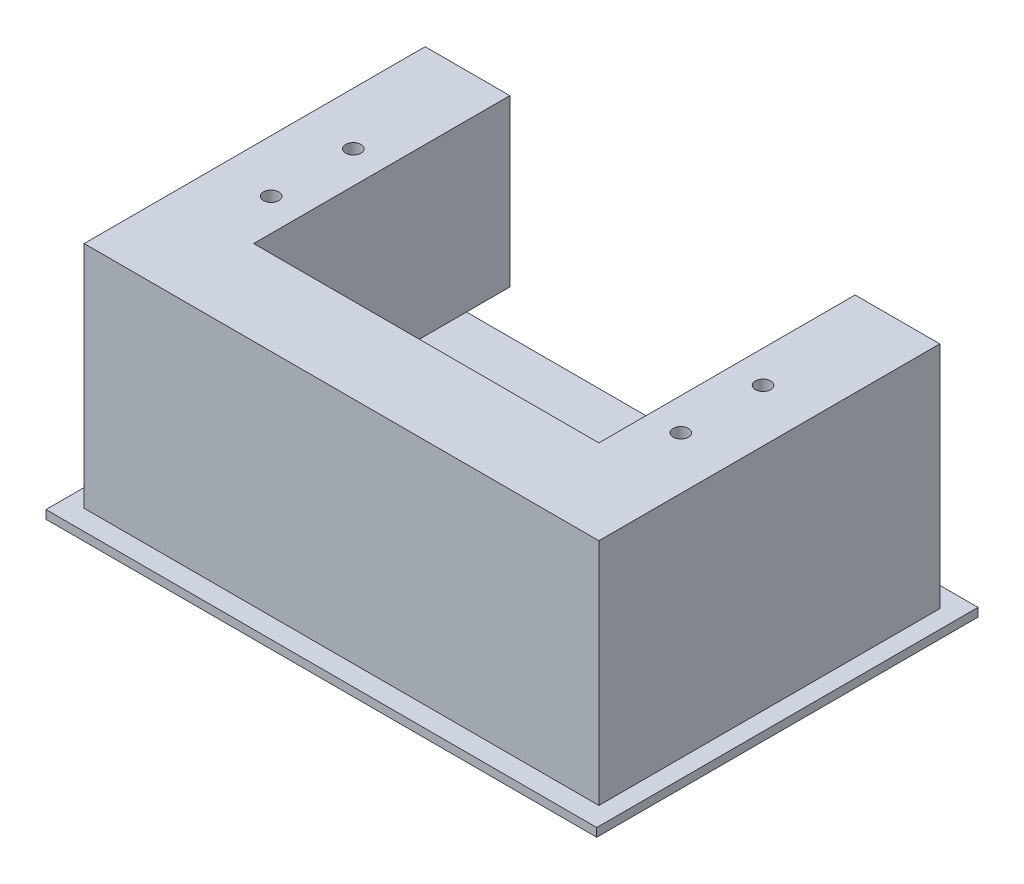
ISO-10303-21;
HEADER;
FILE_DESCRIPTION(('STEP AP214'),'2;1');
FILE_NAME('part.step','',(''),(''),'','','');
FILE_SCHEMA(('AUTOMOTIVE_DESIGN { 1 0 10303 214 1 1 1 1 }'));
ENDSEC;
DATA;
#1=APPLICATION_CONTEXT('core data for automotive mechanical design processes');
#2=APPLICATION_PROTOCOL_DEFINITION('international standard','automotive_design',2000,#1);
#3=PRODUCT_CONTEXT('',#1,'mechanical');
#4=PRODUCT('Part','Part','',(#3));
#5=PRODUCT_RELATED_PRODUCT_CATEGORY('part','',(#4));
#6=PRODUCT_DEFINITION_FORMATION('','',#4);
#7=PRODUCT_DEFINITION_CONTEXT('part definition',#1,'design');
#8=PRODUCT_DEFINITION('design','',#6,#7);
#9=PRODUCT_DEFINITION_SHAPE('','',#8);
#10=(LENGTH_UNIT() NAMED_UNIT(*) SI_UNIT(.MILLI.,.METRE.));
#11=(NAMED_UNIT(*) PLANE_ANGLE_UNIT() SI_UNIT($,.RADIAN.));
#12=(NAMED_UNIT(*) SI_UNIT($,.STERADIAN.) SOLID_ANGLE_UNIT());
#13=UNCERTAINTY_MEASURE_WITH_UNIT(LENGTH_MEASURE(1.E-05),#10,'distance_accuracy_value','');
#14=(GEOMETRIC_REPRESENTATION_CONTEXT(3) GLOBAL_UNCERTAINTY_ASSIGNED_CONTEXT((#13)) GLOBAL_UNIT_ASSIGNED_CONTEXT((#10,
#11,#12)) REPRESENTATION_CONTEXT('',''));
#15=CARTESIAN_POINT('',(0.,0.,0.));
#16=DIRECTION('',(0.,0.,1.));
#17=DIRECTION('',(1.,0.,0.));
#18=AXIS2_PLACEMENT_3D('',#15,#16,#17);
#19=CARTESIAN_POINT('',(20.375,28.06,-20.12));
#20=DIRECTION('',(0.,0.,-1.));
#21=DIRECTION('',(-1.,0.,0.));
#22=AXIS2_PLACEMENT_3D('',#19,#20,#21);
#23=PLANE('',#22);
#24=DIRECTION('',(1.,0.,0.));
#25=VECTOR('',#24,1.);
#26=CARTESIAN_POINT('',(20.375,28.06,-20.12));
#27=LINE('',#26,#25);
#28=CARTESIAN_POINT('',(-30.375,28.06,-20.12));
#29=VERTEX_POINT('',#28);
#30=CARTESIAN_POINT('',(-20.375,28.06,-20.12));
#31=VERTEX_POINT('',#30);
#32=EDGE_CURVE('E153',#29,#31,#27,.T.);
#33=ORIENTED_EDGE('',*,*,#32,.T.);
#34=DIRECTION('',(0.,1.,0.));
#35=VECTOR('',#34,1.);
#36=CARTESIAN_POINT('',(-20.375,-40.9590574250661,-20.12));
#37=LINE('',#36,#35);
#38=CARTESIAN_POINT('',(-20.375,8.49999999999999,-20.12));
#39=VERTEX_POINT('',#38);
#40=EDGE_CURVE('E162',#39,#31,#37,.T.);
#41=ORIENTED_EDGE('',*,*,#40,.F.);
#42=DIRECTION('',(-1.,0.,0.));
#43=VECTOR('',#42,1.);
#44=CARTESIAN_POINT('',(38.1090040599973,8.49999999999999,-20.12));
#45=LINE('',#44,#43);
#46=CARTESIAN_POINT('',(-30.375,8.49999999999999,-20.12));
#47=VERTEX_POINT('',#46);
#48=EDGE_CURVE('E270',#39,#47,#45,.T.);
#49=ORIENTED_EDGE('',*,*,#48,.T.);
#50=DIRECTION('',(0.,-1.,0.));
#51=VECTOR('',#50,1.);
#52=CARTESIAN_POINT('',(-30.375,28.06,-20.12));
#53=LINE('',#52,#51);
#54=EDGE_CURVE('E172',#29,#47,#53,.T.);
#55=ORIENTED_EDGE('',*,*,#54,.F.);
#56=EDGE_LOOP('',(#33,#41,#49,#55));
#57=FACE_BOUND('',#56,.T.);
#58=ADVANCED_FACE('F43',(#57),#23,.T.);
#59=CARTESIAN_POINT('',(32.501,8.5,-4.05));
#60=DIRECTION('',(0.,1.,0.));
#61=DIRECTION('',(0.,0.,1.));
#62=AXIS2_PLACEMENT_3D('',#59,#60,#61);
#63=PLANE('',#62);
#64=ORIENTED_EDGE('',*,*,#48,.F.);
#65=DIRECTION('',(0.,0.,-1.));
#66=VECTOR('',#65,1.);
#67=CARTESIAN_POINT('',(-20.375,8.5,-4.05000000000001));
#68=LINE('',#67,#66);
#69=CARTESIAN_POINT('',(-20.375,8.5,4.05));
#70=VERTEX_POINT('',#69);
#71=EDGE_CURVE('E166',#70,#39,#68,.T.);
#72=ORIENTED_EDGE('',*,*,#71,.F.);
#73=DIRECTION('',(-1.,0.,0.));
#74=VECTOR('',#73,1.);
#75=CARTESIAN_POINT('',(32.501,8.5,4.05));
#76=LINE('',#75,#74);
#77=CARTESIAN_POINT('',(-30.375,8.5,4.05));
#78=VERTEX_POINT('',#77);
#79=EDGE_CURVE('E242',#70,#78,#76,.T.);
#80=ORIENTED_EDGE('',*,*,#79,.T.);
#81=DIRECTION('',(0.,0.,-1.));
#82=VECTOR('',#81,1.);
#83=CARTESIAN_POINT('',(-30.375,8.5,-4.05));
#84=LINE('',#83,#82);
#85=EDGE_CURVE('E286',#78,#47,#84,.T.);
#86=ORIENTED_EDGE('',*,*,#85,.T.);
#87=EDGE_LOOP('',(#64,#72,#80,#86));
#88=FACE_BOUND('',#87,.T.);
#89=ADVANCED_FACE('F321',(#88),#63,.F.);
#90=CARTESIAN_POINT('',(0.,1.,0.));
#91=DIRECTION('',(0.,-1.,0.));
#92=DIRECTION('',(0.,0.,-1.));
#93=AXIS2_PLACEMENT_3D('',#90,#91,#92);
#94=PLANE('',#93);
#95=DIRECTION('',(0.,0.,1.));
#96=VECTOR('',#95,1.);
#97=CARTESIAN_POINT('',(20.375,1.,-20.12));
#98=LINE('',#97,#96);
#99=CARTESIAN_POINT('',(20.375,1.,-20.12));
#100=VERTEX_POINT('',#99);
#101=CARTESIAN_POINT('',(20.375,1.,10.12));
#102=VERTEX_POINT('',#101);
#103=EDGE_CURVE('E60',#100,#102,#98,.T.);
#104=ORIENTED_EDGE('',*,*,#103,.F.);
#105=DIRECTION('',(1.,0.,0.));
#106=VECTOR('',#105,1.);
#107=CARTESIAN_POINT('',(20.375,1.,-20.12));
#108=LINE('',#107,#106);
#109=CARTESIAN_POINT('',(30.375,1.,-20.12));
#110=VERTEX_POINT('',#109);
#111=EDGE_CURVE('E189',#100,#110,#108,.T.);
#112=ORIENTED_EDGE('',*,*,#111,.T.);
#113=DIRECTION('',(0.,0.,1.));
#114=VECTOR('',#113,1.);
#115=CARTESIAN_POINT('',(30.375,1.,-20.12));
#116=LINE('',#115,#114);
#117=CARTESIAN_POINT('',(30.375,1.,20.12));
#118=VERTEX_POINT('',#117);
#119=EDGE_CURVE('E186',#110,#118,#116,.T.);
#120=ORIENTED_EDGE('',*,*,#119,.T.);
#121=DIRECTION('',(1.,0.,0.));
#122=VECTOR('',#121,1.);
#123=CARTESIAN_POINT('',(20.375,1.,20.12));
#124=LINE('',#123,#122);
#125=CARTESIAN_POINT('',(-30.375,1.,20.12));
#126=VERTEX_POINT('',#125);
#127=EDGE_CURVE('E183',#126,#118,#124,.T.);
#128=ORIENTED_EDGE('',*,*,#127,.F.);
#129=DIRECTION('',(0.,0.,1.));
#130=VECTOR('',#129,1.);
#131=CARTESIAN_POINT('',(-30.375,1.,-20.12));
#132=LINE('',#131,#130);
#133=CARTESIAN_POINT('',(-30.375,1.,4.05));
#134=VERTEX_POINT('',#133);
#135=EDGE_CURVE('E159',#134,#126,#132,.T.);
#136=ORIENTED_EDGE('',*,*,#135,.F.);
#137=DIRECTION('',(-1.,0.,0.));
#138=VECTOR('',#137,1.);
#139=CARTESIAN_POINT('',(32.501,1.,4.05));
#140=LINE('',#139,#138);
#141=CARTESIAN_POINT('',(-20.375,1.,4.05));
#142=VERTEX_POINT('',#141);
#143=EDGE_CURVE('E285',#142,#134,#140,.T.);
#144=ORIENTED_EDGE('',*,*,#143,.F.);
#145=DIRECTION('',(0.,0.,1.));
#146=VECTOR('',#145,1.);
#147=CARTESIAN_POINT('',(-20.375,1.,-20.12));
#148=LINE('',#147,#146);
#149=CARTESIAN_POINT('',(-20.375,1.,10.12));
#150=VERTEX_POINT('',#149);
#151=EDGE_CURVE('E235',#142,#150,#148,.T.);
#152=ORIENTED_EDGE('',*,*,#151,.T.);
#153=DIRECTION('',(1.,0.,0.));
#154=VECTOR('',#153,1.);
#155=CARTESIAN_POINT('',(-20.375,1.,10.12));
#156=LINE('',#155,#154);
#157=EDGE_CURVE('E280',#150,#102,#156,.T.);
#158=ORIENTED_EDGE('',*,*,#157,.T.);
#159=EDGE_LOOP('',(#104,#112,#120,#128,#136,#144,#152,#158));
#160=FACE_BOUND('',#159,.T.);
#161=DIRECTION('',(0.,0.,-1.));
#162=VECTOR('',#161,1.);
#163=CARTESIAN_POINT('',(32.5,1.,22.5));
#164=LINE('',#163,#162);
#165=CARTESIAN_POINT('',(32.5,1.,22.5));
#166=VERTEX_POINT('',#165);
#167=CARTESIAN_POINT('',(32.5,1.,-22.5));
#168=VERTEX_POINT('',#167);
#169=EDGE_CURVE('E199',#166,#168,#164,.T.);
#170=ORIENTED_EDGE('',*,*,#169,.T.);
#171=DIRECTION('',(-1.,0.,0.));
#172=VECTOR('',#171,1.);
#173=CARTESIAN_POINT('',(-32.5,1.,-22.5));
#174=LINE('',#173,#172);
#175=CARTESIAN_POINT('',(-32.5,1.,-22.5));
#176=VERTEX_POINT('',#175);
#177=EDGE_CURVE('E202',#168,#176,#174,.T.);
#178=ORIENTED_EDGE('',*,*,#177,.T.);
#179=DIRECTION('',(0.,0.,1.));
#180=VECTOR('',#179,1.);
#181=CARTESIAN_POINT('',(-32.5,1.,22.5));
#182=LINE('',#181,#180);
#183=CARTESIAN_POINT('',(-32.5,1.,22.5));
#184=VERTEX_POINT('',#183);
#185=EDGE_CURVE('E205',#176,#184,#182,.T.);
#186=ORIENTED_EDGE('',*,*,#185,.T.);
#187=DIRECTION('',(1.,0.,0.));
#188=VECTOR('',#187,1.);
#189=CARTESIAN_POINT('',(-32.5,1.,22.5));
#190=LINE('',#189,#188);
#191=EDGE_CURVE('E207',#184,#166,#190,.T.);
#192=ORIENTED_EDGE('',*,*,#191,.T.);
#193=EDGE_LOOP('',(#170,#178,#186,#192));
#194=FACE_BOUND('',#193,.T.);
#195=ADVANCED_FACE('F302',(#160,#194),#94,.F.);
#196=CARTESIAN_POINT('',(20.375,28.06,-20.12));
#197=DIRECTION('',(1.,0.,0.));
#198=DIRECTION('',(0.,0.,-1.));
#199=AXIS2_PLACEMENT_3D('',#196,#197,#198);
#200=PLANE('',#199);
#201=ORIENTED_EDGE('',*,*,#103,.T.);
#202=DIRECTION('',(0.,-1.,0.));
#203=VECTOR('',#202,1.);
#204=CARTESIAN_POINT('',(20.375,70.0190574250662,10.12));
#205=LINE('',#204,#203);
#206=CARTESIAN_POINT('',(20.375,28.06,10.12));
#207=VERTEX_POINT('',#206);
#208=EDGE_CURVE('E274',#207,#102,#205,.T.);
#209=ORIENTED_EDGE('',*,*,#208,.F.);
#210=DIRECTION('',(0.,0.,1.));
#211=VECTOR('',#210,1.);
#212=CARTESIAN_POINT('',(20.375,28.06,-20.12));
#213=LINE('',#212,#211);
#214=CARTESIAN_POINT('',(20.375,28.06,-20.12));
#215=VERTEX_POINT('',#214);
#216=EDGE_CURVE('E174',#215,#207,#213,.T.);
#217=ORIENTED_EDGE('',*,*,#216,.F.);
#218=DIRECTION('',(0.,-1.,0.));
#219=VECTOR('',#218,1.);
#220=CARTESIAN_POINT('',(20.375,8.49999999999999,-20.12));
#221=LINE('',#220,#219);
#222=EDGE_CURVE('E169',#215,#100,#221,.T.);
#223=ORIENTED_EDGE('',*,*,#222,.T.);
#224=EDGE_LOOP('',(#201,#209,#217,#223));
#225=FACE_BOUND('',#224,.T.);
#226=ADVANCED_FACE('F272',(#225),#200,.F.);
#227=CARTESIAN_POINT('',(-20.375,28.06,-20.12));
#228=DIRECTION('',(1.,0.,0.));
#229=DIRECTION('',(0.,0.,-1.));
#230=AXIS2_PLACEMENT_3D('',#227,#228,#229);
#231=PLANE('',#230);
#232=ORIENTED_EDGE('',*,*,#71,.T.);
#233=ORIENTED_EDGE('',*,*,#40,.T.);
#234=DIRECTION('',(0.,0.,1.));
#235=VECTOR('',#234,1.);
#236=CARTESIAN_POINT('',(-20.375,28.06,-20.12));
#237=LINE('',#236,#235);
#238=CARTESIAN_POINT('',(-20.375,28.06,10.12));
#239=VERTEX_POINT('',#238);
#240=EDGE_CURVE('E146',#31,#239,#237,.T.);
#241=ORIENTED_EDGE('',*,*,#240,.T.);
#242=DIRECTION('',(0.,-1.,0.));
#243=VECTOR('',#242,1.);
#244=CARTESIAN_POINT('',(-20.375,70.0190574250662,10.12));
#245=LINE('',#244,#243);
#246=EDGE_CURVE('E68',#239,#150,#245,.T.);
#247=ORIENTED_EDGE('',*,*,#246,.T.);
#248=ORIENTED_EDGE('',*,*,#151,.F.);
#249=DIRECTION('',(0.,1.,0.));
#250=VECTOR('',#249,1.);
#251=CARTESIAN_POINT('',(-20.375,8.5,4.05));
#252=LINE('',#251,#250);
#253=EDGE_CURVE('E291',#142,#70,#252,.T.);
#254=ORIENTED_EDGE('',*,*,#253,.T.);
#255=EDGE_LOOP('',(#232,#233,#241,#247,#248,#254));
#256=FACE_BOUND('',#255,.T.);
#257=ADVANCED_FACE('F163',(#256),#231,.T.);
#258=CARTESIAN_POINT('',(32.5,1.,22.5));
#259=DIRECTION('',(-1.,0.,0.));
#260=DIRECTION('',(0.,0.,1.));
#261=AXIS2_PLACEMENT_3D('',#258,#259,#260);
#262=PLANE('',#261);
#263=DIRECTION('',(0.,0.,-1.));
#264=VECTOR('',#263,1.);
#265=CARTESIAN_POINT('',(32.5,0.,22.5));
#266=LINE('',#265,#264);
#267=CARTESIAN_POINT('',(32.5,0.,22.5));
#268=VERTEX_POINT('',#267);
#269=CARTESIAN_POINT('',(32.5,0.,-22.5));
#270=VERTEX_POINT('',#269);
#271=EDGE_CURVE('E198',#268,#270,#266,.T.);
#272=ORIENTED_EDGE('',*,*,#271,.T.);
#273=DIRECTION('',(0.,-1.,0.));
#274=VECTOR('',#273,1.);
#275=CARTESIAN_POINT('',(32.5,1.,-22.5));
#276=LINE('',#275,#274);
#277=EDGE_CURVE('E11',#168,#270,#276,.T.);
#278=ORIENTED_EDGE('',*,*,#277,.F.);
#279=ORIENTED_EDGE('',*,*,#169,.F.);
#280=DIRECTION('',(0.,-1.,0.));
#281=VECTOR('',#280,1.);
#282=CARTESIAN_POINT('',(32.5,1.,22.5));
#283=LINE('',#282,#281);
#284=EDGE_CURVE('E209',#166,#268,#283,.T.);
#285=ORIENTED_EDGE('',*,*,#284,.T.);
#286=EDGE_LOOP('',(#272,#278,#279,#285));
#287=FACE_BOUND('',#286,.T.);
#288=ADVANCED_FACE('F45',(#287),#262,.F.);
#289=CARTESIAN_POINT('',(-32.5,1.,-22.5));
#290=DIRECTION('',(0.,0.,1.));
#291=DIRECTION('',(1.,0.,0.));
#292=AXIS2_PLACEMENT_3D('',#289,#290,#291);
#293=PLANE('',#292);
#294=DIRECTION('',(-1.,0.,0.));
#295=VECTOR('',#294,1.);
#296=CARTESIAN_POINT('',(-32.5,0.,-22.5));
#297=LINE('',#296,#295);
#298=CARTESIAN_POINT('',(-32.5,0.,-22.5));
#299=VERTEX_POINT('',#298);
#300=EDGE_CURVE('E212',#270,#299,#297,.T.);
#301=ORIENTED_EDGE('',*,*,#300,.T.);
#302=DIRECTION('',(0.,-1.,0.));
#303=VECTOR('',#302,1.);
#304=CARTESIAN_POINT('',(-32.5,1.,-22.5));
#305=LINE('',#304,#303);
#306=EDGE_CURVE('E52',#176,#299,#305,.T.);
#307=ORIENTED_EDGE('',*,*,#306,.F.);
#308=ORIENTED_EDGE('',*,*,#177,.F.);
#309=ORIENTED_EDGE('',*,*,#277,.T.);
#310=EDGE_LOOP('',(#301,#307,#308,#309));
#311=FACE_BOUND('',#310,.T.);
#312=ADVANCED_FACE('F357',(#311),#293,.F.);
#313=CARTESIAN_POINT('',(-32.5,1.,22.5));
#314=DIRECTION('',(1.,0.,0.));
#315=DIRECTION('',(0.,0.,-1.));
#316=AXIS2_PLACEMENT_3D('',#313,#314,#315);
#317=PLANE('',#316);
#318=DIRECTION('',(0.,0.,1.));
#319=VECTOR('',#318,1.);
#320=CARTESIAN_POINT('',(-32.5,0.,22.5));
#321=LINE('',#320,#319);
#322=CARTESIAN_POINT('',(-32.5,0.,22.5));
#323=VERTEX_POINT('',#322);
#324=EDGE_CURVE('E214',#299,#323,#321,.T.);
#325=ORIENTED_EDGE('',*,*,#324,.T.);
#326=DIRECTION('',(0.,-1.,0.));
#327=VECTOR('',#326,1.);
#328=CARTESIAN_POINT('',(-32.5,1.,22.5));
#329=LINE('',#328,#327);
#330=EDGE_CURVE('E219',#184,#323,#329,.T.);
#331=ORIENTED_EDGE('',*,*,#330,.F.);
#332=ORIENTED_EDGE('',*,*,#185,.F.);
#333=ORIENTED_EDGE('',*,*,#306,.T.);
#334=EDGE_LOOP('',(#325,#331,#332,#333));
#335=FACE_BOUND('',#334,.T.);
#336=ADVANCED_FACE('F354',(#335),#317,.F.);
#337=CARTESIAN_POINT('',(-32.5,1.,22.5));
#338=DIRECTION('',(0.,0.,-1.));
#339=DIRECTION('',(-1.,0.,0.));
#340=AXIS2_PLACEMENT_3D('',#337,#338,#339);
#341=PLANE('',#340);
#342=DIRECTION('',(1.,0.,0.));
#343=VECTOR('',#342,1.);
#344=CARTESIAN_POINT('',(-32.5,0.,22.5));
#345=LINE('',#344,#343);
#346=EDGE_CURVE('E203',#323,#268,#345,.T.);
#347=ORIENTED_EDGE('',*,*,#346,.T.);
#348=ORIENTED_EDGE('',*,*,#284,.F.);
#349=ORIENTED_EDGE('',*,*,#191,.F.);
#350=ORIENTED_EDGE('',*,*,#330,.T.);
#351=EDGE_LOOP('',(#347,#348,#349,#350));
#352=FACE_BOUND('',#351,.T.);
#353=ADVANCED_FACE('F316',(#352),#341,.F.);
#354=CARTESIAN_POINT('',(0.,0.,0.));
#355=DIRECTION('',(0.,-1.,0.));
#356=DIRECTION('',(0.,0.,-1.));
#357=AXIS2_PLACEMENT_3D('',#354,#355,#356);
#358=PLANE('',#357);
#359=ORIENTED_EDGE('',*,*,#271,.F.);
#360=ORIENTED_EDGE('',*,*,#346,.F.);
#361=ORIENTED_EDGE('',*,*,#324,.F.);
#362=ORIENTED_EDGE('',*,*,#300,.F.);
#363=EDGE_LOOP('',(#359,#360,#361,#362));
#364=FACE_BOUND('',#363,.T.);
#365=ADVANCED_FACE('F307',(#364),#358,.T.);
#366=CARTESIAN_POINT('',(20.375,28.06,20.12));
#367=DIRECTION('',(0.,0.,-1.));
#368=DIRECTION('',(-1.,0.,0.));
#369=AXIS2_PLACEMENT_3D('',#366,#367,#368);
#370=PLANE('',#369);
#371=ORIENTED_EDGE('',*,*,#127,.T.);
#372=DIRECTION('',(0.,-1.,0.));
#373=VECTOR('',#372,1.);
#374=CARTESIAN_POINT('',(30.375,28.06,20.12));
#375=LINE('',#374,#373);
#376=CARTESIAN_POINT('',(30.375,28.06,20.12));
#377=VERTEX_POINT('',#376);
#378=EDGE_CURVE('E195',#377,#118,#375,.T.);
#379=ORIENTED_EDGE('',*,*,#378,.F.);
#380=DIRECTION('',(1.,0.,0.));
#381=VECTOR('',#380,1.);
#382=CARTESIAN_POINT('',(20.375,28.06,20.12));
#383=LINE('',#382,#381);
#384=CARTESIAN_POINT('',(-30.375,28.06,20.12));
#385=VERTEX_POINT('',#384);
#386=EDGE_CURVE('E192',#385,#377,#383,.T.);
#387=ORIENTED_EDGE('',*,*,#386,.F.);
#388=DIRECTION('',(0.,-1.,0.));
#389=VECTOR('',#388,1.);
#390=CARTESIAN_POINT('',(-30.375,28.06,20.12));
#391=LINE('',#390,#389);
#392=EDGE_CURVE('E248',#385,#126,#391,.T.);
#393=ORIENTED_EDGE('',*,*,#392,.T.);
#394=EDGE_LOOP('',(#371,#379,#387,#393));
#395=FACE_BOUND('',#394,.T.);
#396=ADVANCED_FACE('F305',(#395),#370,.F.);
#397=CARTESIAN_POINT('',(30.375,28.06,-20.12));
#398=DIRECTION('',(1.,0.,0.));
#399=DIRECTION('',(0.,0.,-1.));
#400=AXIS2_PLACEMENT_3D('',#397,#398,#399);
#401=PLANE('',#400);
#402=ORIENTED_EDGE('',*,*,#119,.F.);
#403=DIRECTION('',(0.,-1.,0.));
#404=VECTOR('',#403,1.);
#405=CARTESIAN_POINT('',(30.375,28.06,-20.12));
#406=LINE('',#405,#404);
#407=CARTESIAN_POINT('',(30.375,28.06,-20.12));
#408=VERTEX_POINT('',#407);
#409=EDGE_CURVE('E177',#408,#110,#406,.T.);
#410=ORIENTED_EDGE('',*,*,#409,.F.);
#411=DIRECTION('',(0.,0.,1.));
#412=VECTOR('',#411,1.);
#413=CARTESIAN_POINT('',(30.375,28.06,-20.12));
#414=LINE('',#413,#412);
#415=EDGE_CURVE('E179',#408,#377,#414,.T.);
#416=ORIENTED_EDGE('',*,*,#415,.T.);
#417=ORIENTED_EDGE('',*,*,#378,.T.);
#418=EDGE_LOOP('',(#402,#410,#416,#417));
#419=FACE_BOUND('',#418,.T.);
#420=ADVANCED_FACE('F265',(#419),#401,.T.);
#421=ORIENTED_EDGE('',*,*,#222,.F.);
#422=EDGE_CURVE('E175',#215,#408,#27,.T.);
#423=ORIENTED_EDGE('',*,*,#422,.T.);
#424=ORIENTED_EDGE('',*,*,#409,.T.);
#425=ORIENTED_EDGE('',*,*,#111,.F.);
#426=EDGE_LOOP('',(#421,#423,#424,#425));
#427=FACE_BOUND('',#426,.T.);
#428=ADVANCED_FACE('F268',(#427),#23,.T.);
#429=CARTESIAN_POINT('',(0.,28.06,0.));
#430=DIRECTION('',(0.,-1.,0.));
#431=DIRECTION('',(0.,0.,-1.));
#432=AXIS2_PLACEMENT_3D('',#429,#430,#431);
#433=PLANE('',#432);
#434=ORIENTED_EDGE('',*,*,#422,.F.);
#435=ORIENTED_EDGE('',*,*,#216,.T.);
#436=DIRECTION('',(-1.,0.,0.));
#437=VECTOR('',#436,1.);
#438=CARTESIAN_POINT('',(-20.375,28.06,10.12));
#439=LINE('',#438,#437);
#440=EDGE_CURVE('E157',#207,#239,#439,.T.);
#441=ORIENTED_EDGE('',*,*,#440,.T.);
#442=ORIENTED_EDGE('',*,*,#240,.F.);
#443=ORIENTED_EDGE('',*,*,#32,.F.);
#444=DIRECTION('',(0.,0.,1.));
#445=VECTOR('',#444,1.);
#446=CARTESIAN_POINT('',(-30.375,28.06,-20.12));
#447=LINE('',#446,#445);
#448=EDGE_CURVE('E158',#29,#385,#447,.T.);
#449=ORIENTED_EDGE('',*,*,#448,.T.);
#450=ORIENTED_EDGE('',*,*,#386,.T.);
#451=ORIENTED_EDGE('',*,*,#415,.F.);
#452=EDGE_LOOP('',(#434,#435,#441,#442,#443,#449,#450,#451));
#453=FACE_BOUND('',#452,.T.);
#454=CARTESIAN_POINT('',(24.175,28.06,-5.45));
#455=DIRECTION('',(0.,-1.,0.));
#456=DIRECTION('',(0.,0.,-1.));
#457=AXIS2_PLACEMENT_3D('',#454,#455,#456);
#458=CIRCLE('',#457,0.9);
#459=CARTESIAN_POINT('',(24.175,28.06,-6.35));
#460=VERTEX_POINT('',#459);
#461=EDGE_CURVE('E187',#460,#460,#458,.F.);
#462=ORIENTED_EDGE('',*,*,#461,.F.);
#463=EDGE_LOOP('',(#462));
#464=FACE_BOUND('',#463,.T.);
#465=CARTESIAN_POINT('',(24.175,28.06,4.25));
#466=DIRECTION('',(0.,-1.,0.));
#467=DIRECTION('',(0.,0.,-1.));
#468=AXIS2_PLACEMENT_3D('',#465,#466,#467);
#469=CIRCLE('',#468,0.9);
#470=CARTESIAN_POINT('',(24.175,28.06,3.35));
#471=VERTEX_POINT('',#470);
#472=EDGE_CURVE('E224',#471,#471,#469,.F.);
#473=ORIENTED_EDGE('',*,*,#472,.F.);
#474=EDGE_LOOP('',(#473));
#475=FACE_BOUND('',#474,.T.);
#476=CARTESIAN_POINT('',(-24.175,28.06,-5.45));
#477=DIRECTION('',(0.,-1.,0.));
#478=DIRECTION('',(0.,0.,-1.));
#479=AXIS2_PLACEMENT_3D('',#476,#477,#478);
#480=CIRCLE('',#479,0.9);
#481=CARTESIAN_POINT('',(-24.175,28.06,-6.35));
#482=VERTEX_POINT('',#481);
#483=EDGE_CURVE('E47',#482,#482,#480,.T.);
#484=ORIENTED_EDGE('',*,*,#483,.T.);
#485=EDGE_LOOP('',(#484));
#486=FACE_BOUND('',#485,.T.);
#487=CARTESIAN_POINT('',(-24.175,28.06,4.25));
#488=DIRECTION('',(0.,-1.,0.));
#489=DIRECTION('',(0.,0.,-1.));
#490=AXIS2_PLACEMENT_3D('',#487,#488,#489);
#491=CIRCLE('',#490,0.9);
#492=CARTESIAN_POINT('',(-24.175,28.06,3.35));
#493=VERTEX_POINT('',#492);
#494=EDGE_CURVE('E229',#493,#493,#491,.T.);
#495=ORIENTED_EDGE('',*,*,#494,.T.);
#496=EDGE_LOOP('',(#495));
#497=FACE_BOUND('',#496,.T.);
#498=ADVANCED_FACE('F149',(#453,#464,#475,#486,#497),#433,.F.);
#499=CARTESIAN_POINT('',(24.175,28.060012,4.25));
#500=DIRECTION('',(0.,-1.,0.));
#501=DIRECTION('',(0.,0.,-1.));
#502=AXIS2_PLACEMENT_3D('',#499,#500,#501);
#503=CYLINDRICAL_SURFACE('',#502,0.9);
#504=CARTESIAN_POINT('',(24.175,18.06,4.25));
#505=DIRECTION('',(0.,1.,0.));
#506=DIRECTION('',(0.,0.,-1.));
#507=AXIS2_PLACEMENT_3D('',#504,#505,#506);
#508=CIRCLE('',#507,0.9);
#509=CARTESIAN_POINT('',(24.175,18.06,3.35));
#510=VERTEX_POINT('',#509);
#511=EDGE_CURVE('E255',#510,#510,#508,.T.);
#512=CARTESIAN_POINT('',(24.175,18.06,3.35));
#513=CARTESIAN_POINT('',(24.175,18.1641666666667,3.35));
#514=CARTESIAN_POINT('',(24.175,18.2683333333333,3.35));
#515=CARTESIAN_POINT('',(24.175,18.4766666666667,3.35));
#516=CARTESIAN_POINT('',(24.175,18.5808333333333,3.35));
#517=CARTESIAN_POINT('',(24.175,18.7891666666667,3.35));
#518=CARTESIAN_POINT('',(24.175,18.8933333333333,3.35));
#519=CARTESIAN_POINT('',(24.175,19.1016666666667,3.35));
#520=CARTESIAN_POINT('',(24.175,19.2058333333333,3.35));
#521=CARTESIAN_POINT('',(24.175,19.4141666666667,3.35));
#522=CARTESIAN_POINT('',(24.175,19.5183333333333,3.35));
#523=CARTESIAN_POINT('',(24.175,19.7266666666667,3.35));
#524=CARTESIAN_POINT('',(24.175,19.8308333333333,3.35));
#525=CARTESIAN_POINT('',(24.175,20.0391666666667,3.35));
#526=CARTESIAN_POINT('',(24.175,20.1433333333333,3.35));
#527=CARTESIAN_POINT('',(24.175,20.3516666666667,3.35));
#528=CARTESIAN_POINT('',(24.175,20.4558333333333,3.35));
#529=CARTESIAN_POINT('',(24.175,20.6641666666667,3.35));
#530=CARTESIAN_POINT('',(24.175,20.7683333333333,3.35));
#531=CARTESIAN_POINT('',(24.175,20.9766666666667,3.35));
#532=CARTESIAN_POINT('',(24.175,21.0808333333333,3.35));
#533=CARTESIAN_POINT('',(24.175,21.2891666666667,3.35));
#534=CARTESIAN_POINT('',(24.175,21.3933333333333,3.35));
#535=CARTESIAN_POINT('',(24.175,21.6016666666667,3.35));
#536=CARTESIAN_POINT('',(24.175,21.7058333333333,3.35));
#537=CARTESIAN_POINT('',(24.175,21.9141666666667,3.35));
#538=CARTESIAN_POINT('',(24.175,22.0183333333333,3.35));
#539=CARTESIAN_POINT('',(24.175,22.2266666666667,3.35));
#540=CARTESIAN_POINT('',(24.175,22.3308333333333,3.35));
#541=CARTESIAN_POINT('',(24.175,22.5391666666667,3.35));
#542=CARTESIAN_POINT('',(24.175,22.6433333333333,3.35));
#543=CARTESIAN_POINT('',(24.175,22.8516666666667,3.35));
#544=CARTESIAN_POINT('',(24.175,22.9558333333333,3.35));
#545=CARTESIAN_POINT('',(24.175,23.1641666666667,3.35));
#546=CARTESIAN_POINT('',(24.175,23.2683333333333,3.35));
#547=CARTESIAN_POINT('',(24.175,23.4766666666667,3.35));
#548=CARTESIAN_POINT('',(24.175,23.5808333333333,3.35));
#549=CARTESIAN_POINT('',(24.175,23.7891666666667,3.35));
#550=CARTESIAN_POINT('',(24.175,23.8933333333333,3.35));
#551=CARTESIAN_POINT('',(24.175,24.1016666666667,3.35));
#552=CARTESIAN_POINT('',(24.175,24.2058333333333,3.35));
#553=CARTESIAN_POINT('',(24.175,24.4141666666667,3.35));
#554=CARTESIAN_POINT('',(24.175,24.5183333333333,3.35));
#555=CARTESIAN_POINT('',(24.175,24.7266666666667,3.35));
#556=CARTESIAN_POINT('',(24.175,24.8308333333333,3.35));
#557=CARTESIAN_POINT('',(24.175,25.0391666666667,3.35));
#558=CARTESIAN_POINT('',(24.175,25.1433333333333,3.35));
#559=CARTESIAN_POINT('',(24.175,25.3516666666667,3.35));
#560=CARTESIAN_POINT('',(24.175,25.4558333333333,3.35));
#561=CARTESIAN_POINT('',(24.175,25.6641666666667,3.35));
#562=CARTESIAN_POINT('',(24.175,25.7683333333333,3.35));
#563=CARTESIAN_POINT('',(24.175,25.9766666666667,3.35));
#564=CARTESIAN_POINT('',(24.175,26.0808333333333,3.35));
#565=CARTESIAN_POINT('',(24.175,26.2891666666667,3.35));
#566=CARTESIAN_POINT('',(24.175,26.3933333333333,3.35));
#567=CARTESIAN_POINT('',(24.175,26.6016666666667,3.35));
#568=CARTESIAN_POINT('',(24.175,26.7058333333333,3.35));
#569=CARTESIAN_POINT('',(24.175,26.9141666666667,3.35));
#570=CARTESIAN_POINT('',(24.175,27.0183333333333,3.35));
#571=CARTESIAN_POINT('',(24.175,27.2266666666667,3.35));
#572=CARTESIAN_POINT('',(24.175,27.3308333333333,3.35));
#573=CARTESIAN_POINT('',(24.175,27.5391666666667,3.35));
#574=CARTESIAN_POINT('',(24.175,27.6433333333333,3.35));
#575=CARTESIAN_POINT('',(24.175,27.8516666666667,3.35));
#576=CARTESIAN_POINT('',(24.175,27.9558333333333,3.35));
#577=CARTESIAN_POINT('',(24.175,28.06,3.35));
#578=B_SPLINE_CURVE_WITH_KNOTS('',3,(#512,#513,#514,#515,#516,#517,#518,#519,#520,#521,#522,
#523,#524,#525,#526,#527,#528,#529,#530,#531,#532,#533,#534,#535,#536,#537,#538,#539,#540,#541,
#542,#543,#544,#545,#546,#547,#548,#549,#550,#551,#552,#553,#554,#555,#556,#557,#558,#559,#560,
#561,#562,#563,#564,#565,#566,#567,#568,#569,#570,#571,#572,#573,#574,#575,#576,#577),
.UNSPECIFIED.,.F.,.F.,(4,2,2,2,2,2,2,2,2,2,2,2,2,2,2,2,2,2,2,2,2,2,2,2,2,2,2,2,2,2,2,2,4),(0.,
0.3125,0.625000000000001,0.937500000000001,1.25,1.5625,1.875,2.1875,2.5,2.8125,3.125,3.4375,
3.75,4.0625,4.375,4.6875,5.,5.3125,5.625,5.9375,6.25,6.5625,6.875,7.1875,7.5,7.8125,8.125,
8.4375,8.75,9.0625,9.375,9.6875,10.),.UNSPECIFIED.);
#579=EDGE_CURVE('BSEAM335',#510,#471,#578,.T.);
#580=ORIENTED_EDGE('',*,*,#511,.F.);
#581=ORIENTED_EDGE('',*,*,#472,.T.);
#582=ORIENTED_EDGE('',*,*,#579,.T.);
#583=ORIENTED_EDGE('',*,*,#579,.F.);
#584=EDGE_LOOP('',(#580,#582,#581,#583));
#585=FACE_BOUND('',#584,.T.);
#586=ADVANCED_FACE('F335',(#585),#503,.F.);
#587=CARTESIAN_POINT('',(24.175,18.06,4.25));
#588=DIRECTION('',(0.,-1.,0.));
#589=DIRECTION('',(0.,0.,-1.));
#590=AXIS2_PLACEMENT_3D('',#587,#588,#589);
#591=PLANE('',#590);
#592=ORIENTED_EDGE('',*,*,#511,.T.);
#593=EDGE_LOOP('',(#592));
#594=FACE_BOUND('',#593,.T.);
#595=ADVANCED_FACE('F340',(#594),#591,.F.);
#596=CARTESIAN_POINT('',(24.175,28.060012,-5.45));
#597=DIRECTION('',(0.,-1.,0.));
#598=DIRECTION('',(0.,0.,-1.));
#599=AXIS2_PLACEMENT_3D('',#596,#597,#598);
#600=CYLINDRICAL_SURFACE('',#599,0.9);
#601=CARTESIAN_POINT('',(24.175,18.06,-5.45));
#602=DIRECTION('',(0.,1.,0.));
#603=DIRECTION('',(0.,0.,1.));
#604=AXIS2_PLACEMENT_3D('',#601,#602,#603);
#605=CIRCLE('',#604,0.9);
#606=CARTESIAN_POINT('',(24.175,18.06,-6.35));
#607=VERTEX_POINT('',#606);
#608=EDGE_CURVE('E227',#607,#607,#605,.T.);
#609=CARTESIAN_POINT('',(24.175,18.06,-6.35));
#610=CARTESIAN_POINT('',(24.175,18.1641666666667,-6.35));
#611=CARTESIAN_POINT('',(24.175,18.2683333333333,-6.35));
#612=CARTESIAN_POINT('',(24.175,18.4766666666667,-6.35));
#613=CARTESIAN_POINT('',(24.175,18.5808333333333,-6.35));
#614=CARTESIAN_POINT('',(24.175,18.7891666666667,-6.35));
#615=CARTESIAN_POINT('',(24.175,18.8933333333333,-6.35));
#616=CARTESIAN_POINT('',(24.175,19.1016666666667,-6.35));
#617=CARTESIAN_POINT('',(24.175,19.2058333333333,-6.35));
#618=CARTESIAN_POINT('',(24.175,19.4141666666667,-6.35));
#619=CARTESIAN_POINT('',(24.175,19.5183333333333,-6.35));
#620=CARTESIAN_POINT('',(24.175,19.7266666666667,-6.35));
#621=CARTESIAN_POINT('',(24.175,19.8308333333333,-6.35));
#622=CARTESIAN_POINT('',(24.175,20.0391666666667,-6.35));
#623=CARTESIAN_POINT('',(24.175,20.1433333333333,-6.35));
#624=CARTESIAN_POINT('',(24.175,20.3516666666667,-6.35));
#625=CARTESIAN_POINT('',(24.175,20.4558333333333,-6.35));
#626=CARTESIAN_POINT('',(24.175,20.6641666666667,-6.35));
#627=CARTESIAN_POINT('',(24.175,20.7683333333333,-6.35));
#628=CARTESIAN_POINT('',(24.175,20.9766666666667,-6.35));
#629=CARTESIAN_POINT('',(24.175,21.0808333333333,-6.35));
#630=CARTESIAN_POINT('',(24.175,21.2891666666667,-6.35));
#631=CARTESIAN_POINT('',(24.175,21.3933333333333,-6.35));
#632=CARTESIAN_POINT('',(24.175,21.6016666666667,-6.35));
#633=CARTESIAN_POINT('',(24.175,21.7058333333333,-6.35));
#634=CARTESIAN_POINT('',(24.175,21.9141666666667,-6.35));
#635=CARTESIAN_POINT('',(24.175,22.0183333333333,-6.35));
#636=CARTESIAN_POINT('',(24.175,22.2266666666667,-6.35));
#637=CARTESIAN_POINT('',(24.175,22.3308333333333,-6.35));
#638=CARTESIAN_POINT('',(24.175,22.5391666666667,-6.35));
#639=CARTESIAN_POINT('',(24.175,22.6433333333333,-6.35));
#640=CARTESIAN_POINT('',(24.175,22.8516666666667,-6.35));
#641=CARTESIAN_POINT('',(24.175,22.9558333333333,-6.35));
#642=CARTESIAN_POINT('',(24.175,23.1641666666667,-6.35));
#643=CARTESIAN_POINT('',(24.175,23.2683333333333,-6.35));
#644=CARTESIAN_POINT('',(24.175,23.4766666666667,-6.35));
#645=CARTESIAN_POINT('',(24.175,23.5808333333333,-6.35));
#646=CARTESIAN_POINT('',(24.175,23.7891666666667,-6.35));
#647=CARTESIAN_POINT('',(24.175,23.8933333333333,-6.35));
#648=CARTESIAN_POINT('',(24.175,24.1016666666667,-6.35));
#649=CARTESIAN_POINT('',(24.175,24.2058333333333,-6.35));
#650=CARTESIAN_POINT('',(24.175,24.4141666666667,-6.35));
#651=CARTESIAN_POINT('',(24.175,24.5183333333333,-6.35));
#652=CARTESIAN_POINT('',(24.175,24.7266666666667,-6.35));
#653=CARTESIAN_POINT('',(24.175,24.8308333333333,-6.35));
#654=CARTESIAN_POINT('',(24.175,25.0391666666667,-6.35));
#655=CARTESIAN_POINT('',(24.175,25.1433333333333,-6.35));
#656=CARTESIAN_POINT('',(24.175,25.3516666666667,-6.35));
#657=CARTESIAN_POINT('',(24.175,25.4558333333333,-6.35));
#658=CARTESIAN_POINT('',(24.175,25.6641666666667,-6.35));
#659=CARTESIAN_POINT('',(24.175,25.7683333333333,-6.35));
#660=CARTESIAN_POINT('',(24.175,25.9766666666667,-6.35));
#661=CARTESIAN_POINT('',(24.175,26.0808333333333,-6.35));
#662=CARTESIAN_POINT('',(24.175,26.2891666666667,-6.35));
#663=CARTESIAN_POINT('',(24.175,26.3933333333333,-6.35));
#664=CARTESIAN_POINT('',(24.175,26.6016666666667,-6.35));
#665=CARTESIAN_POINT('',(24.175,26.7058333333333,-6.35));
#666=CARTESIAN_POINT('',(24.175,26.9141666666667,-6.35));
#667=CARTESIAN_POINT('',(24.175,27.0183333333333,-6.35));
#668=CARTESIAN_POINT('',(24.175,27.2266666666667,-6.35));
#669=CARTESIAN_POINT('',(24.175,27.3308333333333,-6.35));
#670=CARTESIAN_POINT('',(24.175,27.5391666666667,-6.35));
#671=CARTESIAN_POINT('',(24.175,27.6433333333333,-6.35));
#672=CARTESIAN_POINT('',(24.175,27.8516666666667,-6.35));
#673=CARTESIAN_POINT('',(24.175,27.9558333333333,-6.35));
#674=CARTESIAN_POINT('',(24.175,28.06,-6.35));
#675=B_SPLINE_CURVE_WITH_KNOTS('',3,(#609,#610,#611,#612,#613,#614,#615,#616,#617,#618,#619,
#620,#621,#622,#623,#624,#625,#626,#627,#628,#629,#630,#631,#632,#633,#634,#635,#636,#637,#638,
#639,#640,#641,#642,#643,#644,#645,#646,#647,#648,#649,#650,#651,#652,#653,#654,#655,#656,#657,
#658,#659,#660,#661,#662,#663,#664,#665,#666,#667,#668,#669,#670,#671,#672,#673,#674),
.UNSPECIFIED.,.F.,.F.,(4,2,2,2,2,2,2,2,2,2,2,2,2,2,2,2,2,2,2,2,2,2,2,2,2,2,2,2,2,2,2,2,4),(0.,
0.3125,0.625000000000001,0.937500000000001,1.25,1.5625,1.875,2.1875,2.5,2.8125,3.125,3.4375,
3.75,4.0625,4.375,4.6875,5.,5.3125,5.625,5.9375,6.25,6.5625,6.875,7.1875,7.5,7.8125,8.125,
8.4375,8.75,9.0625,9.375,9.6875,10.),.UNSPECIFIED.);
#676=EDGE_CURVE('BSEAM447',#607,#460,#675,.T.);
#677=ORIENTED_EDGE('',*,*,#608,.F.);
#678=ORIENTED_EDGE('',*,*,#461,.T.);
#679=ORIENTED_EDGE('',*,*,#676,.T.);
#680=ORIENTED_EDGE('',*,*,#676,.F.);
#681=EDGE_LOOP('',(#677,#679,#678,#680));
#682=FACE_BOUND('',#681,.T.);
#683=ADVANCED_FACE('F447',(#682),#600,.F.);
#684=CARTESIAN_POINT('',(24.175,18.06,-5.45));
#685=DIRECTION('',(0.,1.,0.));
#686=DIRECTION('',(0.,0.,1.));
#687=AXIS2_PLACEMENT_3D('',#684,#685,#686);
#688=PLANE('',#687);
#689=ORIENTED_EDGE('',*,*,#608,.T.);
#690=EDGE_LOOP('',(#689));
#691=FACE_BOUND('',#690,.T.);
#692=ADVANCED_FACE('F456',(#691),#688,.T.);
#693=CARTESIAN_POINT('',(-30.375,28.06,-20.12));
#694=DIRECTION('',(1.,0.,0.));
#695=DIRECTION('',(0.,0.,-1.));
#696=AXIS2_PLACEMENT_3D('',#693,#694,#695);
#697=PLANE('',#696);
#698=ORIENTED_EDGE('',*,*,#54,.T.);
#699=ORIENTED_EDGE('',*,*,#85,.F.);
#700=DIRECTION('',(0.,1.,0.));
#701=VECTOR('',#700,1.);
#702=CARTESIAN_POINT('',(-30.375,8.5,4.05));
#703=LINE('',#702,#701);
#704=EDGE_CURVE('E278',#134,#78,#703,.T.);
#705=ORIENTED_EDGE('',*,*,#704,.F.);
#706=ORIENTED_EDGE('',*,*,#135,.T.);
#707=ORIENTED_EDGE('',*,*,#392,.F.);
#708=ORIENTED_EDGE('',*,*,#448,.F.);
#709=EDGE_LOOP('',(#698,#699,#705,#706,#707,#708));
#710=FACE_BOUND('',#709,.T.);
#711=ADVANCED_FACE('F300',(#710),#697,.F.);
#712=CARTESIAN_POINT('',(-24.175,28.060012,4.25));
#713=DIRECTION('',(0.,-1.,0.));
#714=DIRECTION('',(0.,0.,-1.));
#715=AXIS2_PLACEMENT_3D('',#712,#713,#714);
#716=CYLINDRICAL_SURFACE('',#715,0.9);
#717=CARTESIAN_POINT('',(-24.175,18.06,4.25));
#718=DIRECTION('',(0.,-1.,0.));
#719=DIRECTION('',(0.,0.,-1.));
#720=AXIS2_PLACEMENT_3D('',#717,#718,#719);
#721=CIRCLE('',#720,0.9);
#722=CARTESIAN_POINT('',(-24.175,18.06,3.35));
#723=VERTEX_POINT('',#722);
#724=EDGE_CURVE('E237',#723,#723,#721,.T.);
#725=CARTESIAN_POINT('',(-24.175,18.06,3.35));
#726=CARTESIAN_POINT('',(-24.175,18.1641666666667,3.35));
#727=CARTESIAN_POINT('',(-24.175,18.2683333333333,3.35));
#728=CARTESIAN_POINT('',(-24.175,18.4766666666667,3.35));
#729=CARTESIAN_POINT('',(-24.175,18.5808333333333,3.35));
#730=CARTESIAN_POINT('',(-24.175,18.7891666666667,3.35));
#731=CARTESIAN_POINT('',(-24.175,18.8933333333333,3.35));
#732=CARTESIAN_POINT('',(-24.175,19.1016666666667,3.35));
#733=CARTESIAN_POINT('',(-24.175,19.2058333333333,3.35));
#734=CARTESIAN_POINT('',(-24.175,19.4141666666667,3.35));
#735=CARTESIAN_POINT('',(-24.175,19.5183333333333,3.35));
#736=CARTESIAN_POINT('',(-24.175,19.7266666666667,3.35));
#737=CARTESIAN_POINT('',(-24.175,19.8308333333333,3.35));
#738=CARTESIAN_POINT('',(-24.175,20.0391666666667,3.35));
#739=CARTESIAN_POINT('',(-24.175,20.1433333333333,3.35));
#740=CARTESIAN_POINT('',(-24.175,20.3516666666667,3.35));
#741=CARTESIAN_POINT('',(-24.175,20.4558333333333,3.35));
#742=CARTESIAN_POINT('',(-24.175,20.6641666666667,3.35));
#743=CARTESIAN_POINT('',(-24.175,20.7683333333333,3.35));
#744=CARTESIAN_POINT('',(-24.175,20.9766666666667,3.35));
#745=CARTESIAN_POINT('',(-24.175,21.0808333333333,3.35));
#746=CARTESIAN_POINT('',(-24.175,21.2891666666667,3.35));
#747=CARTESIAN_POINT('',(-24.175,21.3933333333333,3.35));
#748=CARTESIAN_POINT('',(-24.175,21.6016666666667,3.35));
#749=CARTESIAN_POINT('',(-24.175,21.7058333333333,3.35));
#750=CARTESIAN_POINT('',(-24.175,21.9141666666667,3.35));
#751=CARTESIAN_POINT('',(-24.175,22.0183333333333,3.35));
#752=CARTESIAN_POINT('',(-24.175,22.2266666666667,3.35));
#753=CARTESIAN_POINT('',(-24.175,22.3308333333333,3.35));
#754=CARTESIAN_POINT('',(-24.175,22.5391666666667,3.35));
#755=CARTESIAN_POINT('',(-24.175,22.6433333333333,3.35));
#756=CARTESIAN_POINT('',(-24.175,22.8516666666667,3.35));
#757=CARTESIAN_POINT('',(-24.175,22.9558333333333,3.35));
#758=CARTESIAN_POINT('',(-24.175,23.1641666666667,3.35));
#759=CARTESIAN_POINT('',(-24.175,23.2683333333333,3.35));
#760=CARTESIAN_POINT('',(-24.175,23.4766666666667,3.35));
#761=CARTESIAN_POINT('',(-24.175,23.5808333333333,3.35));
#762=CARTESIAN_POINT('',(-24.175,23.7891666666667,3.35));
#763=CARTESIAN_POINT('',(-24.175,23.8933333333333,3.35));
#764=CARTESIAN_POINT('',(-24.175,24.1016666666667,3.35));
#765=CARTESIAN_POINT('',(-24.175,24.2058333333333,3.35));
#766=CARTESIAN_POINT('',(-24.175,24.4141666666667,3.35));
#767=CARTESIAN_POINT('',(-24.175,24.5183333333333,3.35));
#768=CARTESIAN_POINT('',(-24.175,24.7266666666667,3.35));
#769=CARTESIAN_POINT('',(-24.175,24.8308333333333,3.35));
#770=CARTESIAN_POINT('',(-24.175,25.0391666666667,3.35));
#771=CARTESIAN_POINT('',(-24.175,25.1433333333333,3.35));
#772=CARTESIAN_POINT('',(-24.175,25.3516666666667,3.35));
#773=CARTESIAN_POINT('',(-24.175,25.4558333333333,3.35));
#774=CARTESIAN_POINT('',(-24.175,25.6641666666667,3.35));
#775=CARTESIAN_POINT('',(-24.175,25.7683333333333,3.35));
#776=CARTESIAN_POINT('',(-24.175,25.9766666666667,3.35));
#777=CARTESIAN_POINT('',(-24.175,26.0808333333333,3.35));
#778=CARTESIAN_POINT('',(-24.175,26.2891666666667,3.35));
#779=CARTESIAN_POINT('',(-24.175,26.3933333333333,3.35));
#780=CARTESIAN_POINT('',(-24.175,26.6016666666667,3.35));
#781=CARTESIAN_POINT('',(-24.175,26.7058333333333,3.35));
#782=CARTESIAN_POINT('',(-24.175,26.9141666666667,3.35));
#783=CARTESIAN_POINT('',(-24.175,27.0183333333333,3.35));
#784=CARTESIAN_POINT('',(-24.175,27.2266666666667,3.35));
#785=CARTESIAN_POINT('',(-24.175,27.3308333333333,3.35));
#786=CARTESIAN_POINT('',(-24.175,27.5391666666667,3.35));
#787=CARTESIAN_POINT('',(-24.175,27.6433333333333,3.35));
#788=CARTESIAN_POINT('',(-24.175,27.8516666666667,3.35));
#789=CARTESIAN_POINT('',(-24.175,27.9558333333333,3.35));
#790=CARTESIAN_POINT('',(-24.175,28.06,3.35));
#791=B_SPLINE_CURVE_WITH_KNOTS('',3,(#725,#726,#727,#728,#729,#730,#731,#732,#733,#734,#735,
#736,#737,#738,#739,#740,#741,#742,#743,#744,#745,#746,#747,#748,#749,#750,#751,#752,#753,#754,
#755,#756,#757,#758,#759,#760,#761,#762,#763,#764,#765,#766,#767,#768,#769,#770,#771,#772,#773,
#774,#775,#776,#777,#778,#779,#780,#781,#782,#783,#784,#785,#786,#787,#788,#789,#790),
.UNSPECIFIED.,.F.,.F.,(4,2,2,2,2,2,2,2,2,2,2,2,2,2,2,2,2,2,2,2,2,2,2,2,2,2,2,2,2,2,2,2,4),(0.,
0.3125,0.625000000000001,0.937500000000001,1.25,1.5625,1.875,2.1875,2.5,2.8125,3.125,3.4375,
3.75,4.0625,4.375,4.6875,5.,5.3125,5.625,5.9375,6.25,6.5625,6.875,7.1875,7.5,7.8125,8.125,
8.4375,8.75,9.0625,9.375,9.6875,10.),.UNSPECIFIED.);
#792=EDGE_CURVE('BSEAM475',#723,#493,#791,.T.);
#793=ORIENTED_EDGE('',*,*,#724,.T.);
#794=ORIENTED_EDGE('',*,*,#494,.F.);
#795=ORIENTED_EDGE('',*,*,#792,.T.);
#796=ORIENTED_EDGE('',*,*,#792,.F.);
#797=EDGE_LOOP('',(#793,#795,#794,#796));
#798=FACE_BOUND('',#797,.T.);
#799=ADVANCED_FACE('F475',(#798),#716,.F.);
#800=CARTESIAN_POINT('',(-24.175,18.06,4.25));
#801=DIRECTION('',(0.,-1.,0.));
#802=DIRECTION('',(0.,0.,-1.));
#803=AXIS2_PLACEMENT_3D('',#800,#801,#802);
#804=PLANE('',#803);
#805=ORIENTED_EDGE('',*,*,#724,.F.);
#806=EDGE_LOOP('',(#805));
#807=FACE_BOUND('',#806,.T.);
#808=ADVANCED_FACE('F483',(#807),#804,.F.);
#809=CARTESIAN_POINT('',(-24.175,28.060012,-5.45));
#810=DIRECTION('',(0.,-1.,0.));
#811=DIRECTION('',(0.,0.,-1.));
#812=AXIS2_PLACEMENT_3D('',#809,#810,#811);
#813=CYLINDRICAL_SURFACE('',#812,0.9);
#814=CARTESIAN_POINT('',(-24.175,18.06,-5.45));
#815=DIRECTION('',(0.,-1.,0.));
#816=DIRECTION('',(0.,0.,1.));
#817=AXIS2_PLACEMENT_3D('',#814,#815,#816);
#818=CIRCLE('',#817,0.9);
#819=CARTESIAN_POINT('',(-24.175,18.06,-6.35));
#820=VERTEX_POINT('',#819);
#821=EDGE_CURVE('E231',#820,#820,#818,.T.);
#822=CARTESIAN_POINT('',(-24.175,18.06,-6.35));
#823=CARTESIAN_POINT('',(-24.175,18.1641666666667,-6.35));
#824=CARTESIAN_POINT('',(-24.175,18.2683333333333,-6.35));
#825=CARTESIAN_POINT('',(-24.175,18.4766666666667,-6.35));
#826=CARTESIAN_POINT('',(-24.175,18.5808333333333,-6.35));
#827=CARTESIAN_POINT('',(-24.175,18.7891666666667,-6.35));
#828=CARTESIAN_POINT('',(-24.175,18.8933333333333,-6.35));
#829=CARTESIAN_POINT('',(-24.175,19.1016666666667,-6.35));
#830=CARTESIAN_POINT('',(-24.175,19.2058333333333,-6.35));
#831=CARTESIAN_POINT('',(-24.175,19.4141666666667,-6.35));
#832=CARTESIAN_POINT('',(-24.175,19.5183333333333,-6.35));
#833=CARTESIAN_POINT('',(-24.175,19.7266666666667,-6.35));
#834=CARTESIAN_POINT('',(-24.175,19.8308333333333,-6.35));
#835=CARTESIAN_POINT('',(-24.175,20.0391666666667,-6.35));
#836=CARTESIAN_POINT('',(-24.175,20.1433333333333,-6.35));
#837=CARTESIAN_POINT('',(-24.175,20.3516666666667,-6.35));
#838=CARTESIAN_POINT('',(-24.175,20.4558333333333,-6.35));
#839=CARTESIAN_POINT('',(-24.175,20.6641666666667,-6.35));
#840=CARTESIAN_POINT('',(-24.175,20.7683333333333,-6.35));
#841=CARTESIAN_POINT('',(-24.175,20.9766666666667,-6.35));
#842=CARTESIAN_POINT('',(-24.175,21.0808333333333,-6.35));
#843=CARTESIAN_POINT('',(-24.175,21.2891666666667,-6.35));
#844=CARTESIAN_POINT('',(-24.175,21.3933333333333,-6.35));
#845=CARTESIAN_POINT('',(-24.175,21.6016666666667,-6.35));
#846=CARTESIAN_POINT('',(-24.175,21.7058333333333,-6.35));
#847=CARTESIAN_POINT('',(-24.175,21.9141666666667,-6.35));
#848=CARTESIAN_POINT('',(-24.175,22.0183333333333,-6.35));
#849=CARTESIAN_POINT('',(-24.175,22.2266666666667,-6.35));
#850=CARTESIAN_POINT('',(-24.175,22.3308333333333,-6.35));
#851=CARTESIAN_POINT('',(-24.175,22.5391666666667,-6.35));
#852=CARTESIAN_POINT('',(-24.175,22.6433333333333,-6.35));
#853=CARTESIAN_POINT('',(-24.175,22.8516666666667,-6.35));
#854=CARTESIAN_POINT('',(-24.175,22.9558333333333,-6.35));
#855=CARTESIAN_POINT('',(-24.175,23.1641666666667,-6.35));
#856=CARTESIAN_POINT('',(-24.175,23.2683333333333,-6.35));
#857=CARTESIAN_POINT('',(-24.175,23.4766666666667,-6.35));
#858=CARTESIAN_POINT('',(-24.175,23.5808333333333,-6.35));
#859=CARTESIAN_POINT('',(-24.175,23.7891666666667,-6.35));
#860=CARTESIAN_POINT('',(-24.175,23.8933333333333,-6.35));
#861=CARTESIAN_POINT('',(-24.175,24.1016666666667,-6.35));
#862=CARTESIAN_POINT('',(-24.175,24.2058333333333,-6.35));
#863=CARTESIAN_POINT('',(-24.175,24.4141666666667,-6.35));
#864=CARTESIAN_POINT('',(-24.175,24.5183333333333,-6.35));
#865=CARTESIAN_POINT('',(-24.175,24.7266666666667,-6.35));
#866=CARTESIAN_POINT('',(-24.175,24.8308333333333,-6.35));
#867=CARTESIAN_POINT('',(-24.175,25.0391666666667,-6.35));
#868=CARTESIAN_POINT('',(-24.175,25.1433333333333,-6.35));
#869=CARTESIAN_POINT('',(-24.175,25.3516666666667,-6.35));
#870=CARTESIAN_POINT('',(-24.175,25.4558333333333,-6.35));
#871=CARTESIAN_POINT('',(-24.175,25.6641666666667,-6.35));
#872=CARTESIAN_POINT('',(-24.175,25.7683333333333,-6.35));
#873=CARTESIAN_POINT('',(-24.175,25.9766666666667,-6.35));
#874=CARTESIAN_POINT('',(-24.175,26.0808333333333,-6.35));
#875=CARTESIAN_POINT('',(-24.175,26.2891666666667,-6.35));
#876=CARTESIAN_POINT('',(-24.175,26.3933333333333,-6.35));
#877=CARTESIAN_POINT('',(-24.175,26.6016666666667,-6.35));
#878=CARTESIAN_POINT('',(-24.175,26.7058333333333,-6.35));
#879=CARTESIAN_POINT('',(-24.175,26.9141666666667,-6.35));
#880=CARTESIAN_POINT('',(-24.175,27.0183333333333,-6.35));
#881=CARTESIAN_POINT('',(-24.175,27.2266666666667,-6.35));
#882=CARTESIAN_POINT('',(-24.175,27.3308333333333,-6.35));
#883=CARTESIAN_POINT('',(-24.175,27.5391666666667,-6.35));
#884=CARTESIAN_POINT('',(-24.175,27.6433333333333,-6.35));
#885=CARTESIAN_POINT('',(-24.175,27.8516666666667,-6.35));
#886=CARTESIAN_POINT('',(-24.175,27.9558333333333,-6.35));
#887=CARTESIAN_POINT('',(-24.175,28.06,-6.35));
#888=B_SPLINE_CURVE_WITH_KNOTS('',3,(#822,#823,#824,#825,#826,#827,#828,#829,#830,#831,#832,
#833,#834,#835,#836,#837,#838,#839,#840,#841,#842,#843,#844,#845,#846,#847,#848,#849,#850,#851,
#852,#853,#854,#855,#856,#857,#858,#859,#860,#861,#862,#863,#864,#865,#866,#867,#868,#869,#870,
#871,#872,#873,#874,#875,#876,#877,#878,#879,#880,#881,#882,#883,#884,#885,#886,#887),
.UNSPECIFIED.,.F.,.F.,(4,2,2,2,2,2,2,2,2,2,2,2,2,2,2,2,2,2,2,2,2,2,2,2,2,2,2,2,2,2,2,2,4),(0.,
0.3125,0.625000000000001,0.937500000000001,1.25,1.5625,1.875,2.1875,2.5,2.8125,3.125,3.4375,
3.75,4.0625,4.375,4.6875,5.,5.3125,5.625,5.9375,6.25,6.5625,6.875,7.1875,7.5,7.8125,8.125,
8.4375,8.75,9.0625,9.375,9.6875,10.),.UNSPECIFIED.);
#889=EDGE_CURVE('BSEAM493',#820,#482,#888,.T.);
#890=ORIENTED_EDGE('',*,*,#821,.T.);
#891=ORIENTED_EDGE('',*,*,#483,.F.);
#892=ORIENTED_EDGE('',*,*,#889,.T.);
#893=ORIENTED_EDGE('',*,*,#889,.F.);
#894=EDGE_LOOP('',(#890,#892,#891,#893));
#895=FACE_BOUND('',#894,.T.);
#896=ADVANCED_FACE('F493',(#895),#813,.F.);
#897=CARTESIAN_POINT('',(-24.175,18.06,-5.45));
#898=DIRECTION('',(0.,1.,0.));
#899=DIRECTION('',(0.,0.,1.));
#900=AXIS2_PLACEMENT_3D('',#897,#898,#899);
#901=PLANE('',#900);
#902=ORIENTED_EDGE('',*,*,#821,.F.);
#903=EDGE_LOOP('',(#902));
#904=FACE_BOUND('',#903,.T.);
#905=ADVANCED_FACE('F503',(#904),#901,.T.);
#906=CARTESIAN_POINT('',(32.501,8.5,4.05));
#907=DIRECTION('',(0.,0.,1.));
#908=DIRECTION('',(0.,-1.,0.));
#909=AXIS2_PLACEMENT_3D('',#906,#907,#908);
#910=PLANE('',#909);
#911=ORIENTED_EDGE('',*,*,#143,.T.);
#912=ORIENTED_EDGE('',*,*,#704,.T.);
#913=ORIENTED_EDGE('',*,*,#79,.F.);
#914=ORIENTED_EDGE('',*,*,#253,.F.);
#915=EDGE_LOOP('',(#911,#912,#913,#914));
#916=FACE_BOUND('',#915,.T.);
#917=ADVANCED_FACE('F295',(#916),#910,.F.);
#918=CARTESIAN_POINT('',(-20.375,70.0190574250662,10.12));
#919=DIRECTION('',(0.,0.,-1.));
#920=DIRECTION('',(-1.,0.,0.));
#921=AXIS2_PLACEMENT_3D('',#918,#919,#920);
#922=PLANE('',#921);
#923=ORIENTED_EDGE('',*,*,#440,.F.);
#924=ORIENTED_EDGE('',*,*,#208,.T.);
#925=ORIENTED_EDGE('',*,*,#157,.F.);
#926=ORIENTED_EDGE('',*,*,#246,.F.);
#927=EDGE_LOOP('',(#923,#924,#925,#926));
#928=FACE_BOUND('',#927,.T.);
#929=ADVANCED_FACE('F520',(#928),#922,.T.);
#930=CLOSED_SHELL('',(#58,#89,#195,#226,#257,#288,#312,#336,#353,#365,#396,#420,#428,#498,#586,
#595,#683,#692,#711,#799,#808,#896,#905,#917,#929));
#931=MANIFOLD_SOLID_BREP('B2',#930);
#932=ADVANCED_BREP_SHAPE_REPRESENTATION('',(#18,#931),#14);
#933=SHAPE_DEFINITION_REPRESENTATION(#9,#932);
ENDSEC;
END-ISO-10303-21;
